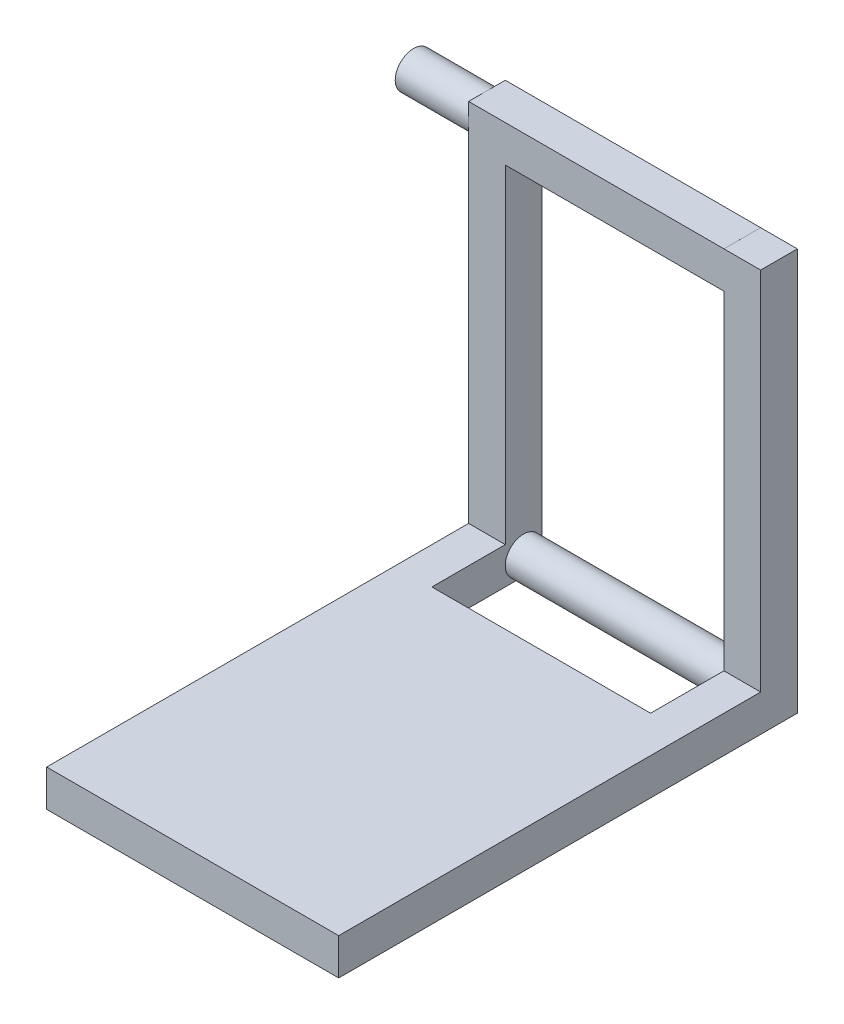
ISO-10303-21;
HEADER;
FILE_DESCRIPTION(('STEP AP214'),'2;1');
FILE_NAME('part.step','',(''),(''),'','','');
FILE_SCHEMA(('AUTOMOTIVE_DESIGN { 1 0 10303 214 1 1 1 1 }'));
ENDSEC;
DATA;
#1=APPLICATION_CONTEXT('core data for automotive mechanical design processes');
#2=APPLICATION_PROTOCOL_DEFINITION('international standard','automotive_design',2000,#1);
#3=PRODUCT_CONTEXT('',#1,'mechanical');
#4=PRODUCT('Part','Part','',(#3));
#5=PRODUCT_RELATED_PRODUCT_CATEGORY('part','',(#4));
#6=PRODUCT_DEFINITION_FORMATION('','',#4);
#7=PRODUCT_DEFINITION_CONTEXT('part definition',#1,'design');
#8=PRODUCT_DEFINITION('design','',#6,#7);
#9=PRODUCT_DEFINITION_SHAPE('','',#8);
#10=(LENGTH_UNIT() NAMED_UNIT(*) SI_UNIT(.MILLI.,.METRE.));
#11=(NAMED_UNIT(*) PLANE_ANGLE_UNIT() SI_UNIT($,.RADIAN.));
#12=(NAMED_UNIT(*) SI_UNIT($,.STERADIAN.) SOLID_ANGLE_UNIT());
#13=UNCERTAINTY_MEASURE_WITH_UNIT(LENGTH_MEASURE(1.E-05),#10,'distance_accuracy_value','');
#14=(GEOMETRIC_REPRESENTATION_CONTEXT(3) GLOBAL_UNCERTAINTY_ASSIGNED_CONTEXT((#13)) GLOBAL_UNIT_ASSIGNED_CONTEXT((#10,
#11,#12)) REPRESENTATION_CONTEXT('',''));
#15=CARTESIAN_POINT('',(0.,0.,0.));
#16=DIRECTION('',(0.,0.,1.));
#17=DIRECTION('',(1.,0.,0.));
#18=AXIS2_PLACEMENT_3D('',#15,#16,#17);
#19=CARTESIAN_POINT('',(-0.488477097251257,21.92,1.0250666456622));
#20=DIRECTION('',(0.,0.,-1.));
#21=DIRECTION('',(-1.,0.,0.));
#22=AXIS2_PLACEMENT_3D('',#19,#20,#21);
#23=PLANE('',#22);
#24=DIRECTION('',(-1.,0.,0.));
#25=VECTOR('',#24,1.);
#26=CARTESIAN_POINT('',(-0.488477097251257,1.99955859309347,1.0250666456622));
#27=LINE('',#26,#25);
#28=CARTESIAN_POINT('',(1.51152290274874,1.99955859309347,1.0250666456622));
#29=VERTEX_POINT('',#28);
#30=CARTESIAN_POINT('',(-0.488477097251257,1.99955859309347,1.0250666456622));
#31=VERTEX_POINT('',#30);
#32=EDGE_CURVE('E224',#29,#31,#27,.T.);
#33=ORIENTED_EDGE('',*,*,#32,.F.);
#34=DIRECTION('',(0.,-1.,0.));
#35=VECTOR('',#34,1.);
#36=CARTESIAN_POINT('',(1.51152290274874,21.92,1.0250666456622));
#37=LINE('',#36,#35);
#38=CARTESIAN_POINT('',(1.51152290274874,19.92,1.0250666456622));
#39=VERTEX_POINT('',#38);
#40=EDGE_CURVE('E349',#39,#29,#37,.T.);
#41=ORIENTED_EDGE('',*,*,#40,.F.);
#42=DIRECTION('',(-1.,0.,0.));
#43=VECTOR('',#42,1.);
#44=CARTESIAN_POINT('',(13.4315229027487,19.92,1.02506664566219));
#45=LINE('',#44,#43);
#46=CARTESIAN_POINT('',(13.4315229027487,19.92,1.02506664566219));
#47=VERTEX_POINT('',#46);
#48=EDGE_CURVE('E289',#47,#39,#45,.T.);
#49=ORIENTED_EDGE('',*,*,#48,.F.);
#50=DIRECTION('',(0.,-1.,0.));
#51=VECTOR('',#50,1.);
#52=CARTESIAN_POINT('',(13.4315229027487,1.99955859309347,1.02506664566219));
#53=LINE('',#52,#51);
#54=CARTESIAN_POINT('',(13.4315229027487,1.99955859309347,1.0250666456622));
#55=VERTEX_POINT('',#54);
#56=EDGE_CURVE('E292',#47,#55,#53,.T.);
#57=ORIENTED_EDGE('',*,*,#56,.T.);
#58=DIRECTION('',(-1.,0.,0.));
#59=VECTOR('',#58,1.);
#60=CARTESIAN_POINT('',(15.4315229027487,1.99955859309347,1.0250666456622));
#61=LINE('',#60,#59);
#62=CARTESIAN_POINT('',(15.4315229027487,1.99955859309347,1.0250666456622));
#63=VERTEX_POINT('',#62);
#64=EDGE_CURVE('E240',#63,#55,#61,.T.);
#65=ORIENTED_EDGE('',*,*,#64,.F.);
#66=DIRECTION('',(0.,-1.,0.));
#67=VECTOR('',#66,1.);
#68=CARTESIAN_POINT('',(15.4315229027487,1.99955859309347,1.02506664566219));
#69=LINE('',#68,#67);
#70=CARTESIAN_POINT('',(15.4315229027487,21.9195585930935,1.02506664566219));
#71=VERTEX_POINT('',#70);
#72=EDGE_CURVE('E293',#71,#63,#69,.T.);
#73=ORIENTED_EDGE('',*,*,#72,.F.);
#74=DIRECTION('',(1.,0.,0.));
#75=VECTOR('',#74,1.);
#76=CARTESIAN_POINT('',(15.4315229027487,21.9195585930935,1.02506664566219));
#77=LINE('',#76,#75);
#78=CARTESIAN_POINT('',(13.4315229027487,21.9195585930935,1.02506664566219));
#79=VERTEX_POINT('',#78);
#80=EDGE_CURVE('E264',#79,#71,#77,.T.);
#81=ORIENTED_EDGE('',*,*,#80,.F.);
#82=DIRECTION('',(0.,-1.,0.));
#83=VECTOR('',#82,1.);
#84=CARTESIAN_POINT('',(13.4315229027487,21.92,1.02506664566219));
#85=LINE('',#84,#83);
#86=CARTESIAN_POINT('',(13.4315229027487,21.92,1.02506664566219));
#87=VERTEX_POINT('',#86);
#88=EDGE_CURVE('E269',#87,#79,#85,.T.);
#89=ORIENTED_EDGE('',*,*,#88,.F.);
#90=DIRECTION('',(1.,0.,0.));
#91=VECTOR('',#90,1.);
#92=CARTESIAN_POINT('',(-0.488477097251257,21.92,1.0250666456622));
#93=LINE('',#92,#91);
#94=CARTESIAN_POINT('',(-0.488477097251257,21.92,1.0250666456622));
#95=VERTEX_POINT('',#94);
#96=EDGE_CURVE('E483',#95,#87,#93,.T.);
#97=ORIENTED_EDGE('',*,*,#96,.F.);
#98=DIRECTION('',(0.,-1.,0.));
#99=VECTOR('',#98,1.);
#100=CARTESIAN_POINT('',(-0.488477097251257,21.92,1.0250666456622));
#101=LINE('',#100,#99);
#102=CARTESIAN_POINT('',(-0.488477097251257,20.92,1.0250666456622));
#103=VERTEX_POINT('',#102);
#104=EDGE_CURVE('E340',#95,#103,#101,.T.);
#105=ORIENTED_EDGE('',*,*,#104,.T.);
#106=EDGE_CURVE('E343',#103,#31,#101,.T.);
#107=ORIENTED_EDGE('',*,*,#106,.T.);
#108=EDGE_LOOP('',(#33,#41,#49,#57,#65,#73,#81,#89,#97,#105,#107));
#109=FACE_BOUND('',#108,.T.);
#110=ADVANCED_FACE('F45',(#109),#23,.F.);
#111=CARTESIAN_POINT('',(-0.488477097251257,21.92,-0.974933354337805));
#112=DIRECTION('',(1.,0.,0.));
#113=DIRECTION('',(0.,0.,-1.));
#114=AXIS2_PLACEMENT_3D('',#111,#112,#113);
#115=PLANE('',#114);
#116=CARTESIAN_POINT('',(-0.488477097251257,20.92,0.0250666456621952));
#117=DIRECTION('',(-1.,0.,0.));
#118=DIRECTION('',(0.,0.,1.));
#119=AXIS2_PLACEMENT_3D('',#116,#117,#118);
#120=CIRCLE('',#119,1.);
#121=CARTESIAN_POINT('',(-0.488477097251257,21.92,0.0250666456621952));
#122=VERTEX_POINT('',#121);
#123=EDGE_CURVE('E321',#103,#122,#120,.T.);
#124=ORIENTED_EDGE('',*,*,#123,.F.);
#125=ORIENTED_EDGE('',*,*,#104,.F.);
#126=DIRECTION('',(0.,0.,1.));
#127=VECTOR('',#126,1.);
#128=CARTESIAN_POINT('',(-0.488477097251257,21.92,-0.974933354337805));
#129=LINE('',#128,#127);
#130=EDGE_CURVE('E477',#122,#95,#129,.T.);
#131=ORIENTED_EDGE('',*,*,#130,.F.);
#132=EDGE_LOOP('',(#124,#125,#131));
#133=FACE_BOUND('',#132,.T.);
#134=ADVANCED_FACE('F436',(#133),#115,.F.);
#135=CARTESIAN_POINT('',(-0.488477097251257,20.92,-0.974933354337805));
#136=VERTEX_POINT('',#135);
#137=EDGE_CURVE('E325',#122,#136,#120,.T.);
#138=ORIENTED_EDGE('',*,*,#137,.F.);
#139=CARTESIAN_POINT('',(-0.488477097251257,21.92,-0.974933354337805));
#140=VERTEX_POINT('',#139);
#141=EDGE_CURVE('E480',#140,#122,#129,.T.);
#142=ORIENTED_EDGE('',*,*,#141,.F.);
#143=DIRECTION('',(0.,-1.,0.));
#144=VECTOR('',#143,1.);
#145=CARTESIAN_POINT('',(-0.488477097251257,21.92,-0.974933354337805));
#146=LINE('',#145,#144);
#147=EDGE_CURVE('E490',#140,#136,#146,.T.);
#148=ORIENTED_EDGE('',*,*,#147,.T.);
#149=EDGE_LOOP('',(#138,#142,#148));
#150=FACE_BOUND('',#149,.T.);
#151=ADVANCED_FACE('F432',(#150),#115,.F.);
#152=CARTESIAN_POINT('',(1.51152290274874,21.92,-0.974933354337805));
#153=DIRECTION('',(-1.,0.,0.));
#154=DIRECTION('',(0.,0.,1.));
#155=AXIS2_PLACEMENT_3D('',#152,#153,#154);
#156=PLANE('',#155);
#157=CARTESIAN_POINT('',(1.51152290274874,0.999558593093465,0.0297089039348952));
#158=DIRECTION('',(1.,0.,0.));
#159=DIRECTION('',(0.,0.,-1.));
#160=AXIS2_PLACEMENT_3D('',#157,#158,#159);
#161=CIRCLE('',#160,1.);
#162=CARTESIAN_POINT('',(1.51152290274874,0.903314289451483,1.0250666456622));
#163=VERTEX_POINT('',#162);
#164=CARTESIAN_POINT('',(1.51152290274874,0.,0.0594178078697917));
#165=VERTEX_POINT('',#164);
#166=EDGE_CURVE('E333',#163,#165,#161,.T.);
#167=ORIENTED_EDGE('',*,*,#166,.F.);
#168=CARTESIAN_POINT('',(1.51152290274874,0.90331428945151,1.0250666456622));
#169=DIRECTION('',(0.,1.,0.));
#170=VECTOR('',#169,1.);
#171=LINE('',#168,#170);
#172=CARTESIAN_POINT('',(1.51152290274874,1.09580289673542,1.0250666456622));
#173=VERTEX_POINT('',#172);
#174=EDGE_CURVE('E354',#163,#173,#171,.T.);
#175=ORIENTED_EDGE('',*,*,#174,.T.);
#176=CARTESIAN_POINT('',(1.51152290274874,0.,0.));
#177=VERTEX_POINT('',#176);
#178=EDGE_CURVE('E336',#177,#173,#161,.T.);
#179=ORIENTED_EDGE('',*,*,#178,.F.);
#180=DIRECTION('',(0.,0.,-1.));
#181=VECTOR('',#180,1.);
#182=CARTESIAN_POINT('',(1.51152290274874,0.,-0.974933354337805));
#183=LINE('',#182,#181);
#184=CARTESIAN_POINT('',(1.51152290274874,0.,-0.974933354337805));
#185=VERTEX_POINT('',#184);
#186=EDGE_CURVE('E194',#177,#185,#183,.T.);
#187=ORIENTED_EDGE('',*,*,#186,.T.);
#188=DIRECTION('',(0.,-1.,0.));
#189=VECTOR('',#188,1.);
#190=CARTESIAN_POINT('',(1.51152290274874,21.92,-0.974933354337805));
#191=LINE('',#190,#189);
#192=CARTESIAN_POINT('',(1.51152290274874,19.92,-0.974933354337805));
#193=VERTEX_POINT('',#192);
#194=EDGE_CURVE('E346',#193,#185,#191,.T.);
#195=ORIENTED_EDGE('',*,*,#194,.F.);
#196=DIRECTION('',(0.,0.,-1.));
#197=VECTOR('',#196,1.);
#198=CARTESIAN_POINT('',(1.51152290274874,19.92,1.0250666456622));
#199=LINE('',#198,#197);
#200=EDGE_CURVE('E268',#39,#193,#199,.T.);
#201=ORIENTED_EDGE('',*,*,#200,.F.);
#202=ORIENTED_EDGE('',*,*,#40,.T.);
#203=DIRECTION('',(0.,0.,-1.));
#204=VECTOR('',#203,1.);
#205=CARTESIAN_POINT('',(1.51152290274874,1.99955859309347,5.0250666456622));
#206=LINE('',#205,#204);
#207=CARTESIAN_POINT('',(1.51152290274874,1.99955859309347,5.0250666456622));
#208=VERTEX_POINT('',#207);
#209=EDGE_CURVE('E237',#208,#29,#206,.T.);
#210=ORIENTED_EDGE('',*,*,#209,.F.);
#211=DIRECTION('',(0.,1.,0.));
#212=VECTOR('',#211,1.);
#213=CARTESIAN_POINT('',(1.51152290274874,0.,5.0250666456622));
#214=LINE('',#213,#212);
#215=CARTESIAN_POINT('',(1.51152290274874,0.,5.0250666456622));
#216=VERTEX_POINT('',#215);
#217=EDGE_CURVE('E228',#216,#208,#214,.T.);
#218=ORIENTED_EDGE('',*,*,#217,.F.);
#219=EDGE_CURVE('E471',#216,#165,#183,.T.);
#220=ORIENTED_EDGE('',*,*,#219,.T.);
#221=EDGE_LOOP('',(#167,#175,#179,#187,#195,#201,#202,#210,#218,#220));
#222=FACE_BOUND('',#221,.T.);
#223=ADVANCED_FACE('F423',(#222),#156,.F.);
#224=EDGE_CURVE('E326',#136,#103,#120,.T.);
#225=ORIENTED_EDGE('',*,*,#224,.F.);
#226=CARTESIAN_POINT('',(-0.488477097251257,0.,-0.974933354337805));
#227=VERTEX_POINT('',#226);
#228=EDGE_CURVE('E189',#136,#227,#146,.T.);
#229=ORIENTED_EDGE('',*,*,#228,.T.);
#230=DIRECTION('',(0.,0.,1.));
#231=VECTOR('',#230,1.);
#232=CARTESIAN_POINT('',(-0.488477097251257,0.,-0.974933354337805));
#233=LINE('',#232,#231);
#234=CARTESIAN_POINT('',(-0.488477097251257,0.,24.0250666456622));
#235=VERTEX_POINT('',#234);
#236=EDGE_CURVE('E183',#227,#235,#233,.T.);
#237=ORIENTED_EDGE('',*,*,#236,.T.);
#238=DIRECTION('',(0.,-1.,0.));
#239=VECTOR('',#238,1.);
#240=CARTESIAN_POINT('',(-0.488477097251257,0.,24.0250666456622));
#241=LINE('',#240,#239);
#242=CARTESIAN_POINT('',(-0.488477097251257,1.99955859309347,24.0250666456622));
#243=VERTEX_POINT('',#242);
#244=EDGE_CURVE('E187',#243,#235,#241,.T.);
#245=ORIENTED_EDGE('',*,*,#244,.F.);
#246=DIRECTION('',(0.,0.,-1.));
#247=VECTOR('',#246,1.);
#248=CARTESIAN_POINT('',(-0.488477097251257,1.99955859309347,5.0250666456622));
#249=LINE('',#248,#247);
#250=EDGE_CURVE('E232',#243,#31,#249,.T.);
#251=ORIENTED_EDGE('',*,*,#250,.T.);
#252=ORIENTED_EDGE('',*,*,#106,.F.);
#253=EDGE_LOOP('',(#225,#229,#237,#245,#251,#252));
#254=FACE_BOUND('',#253,.T.);
#255=ADVANCED_FACE('F47',(#254),#115,.F.);
#256=CARTESIAN_POINT('',(-0.488477097251257,21.92,-0.974933354337805));
#257=DIRECTION('',(0.,0.,1.));
#258=DIRECTION('',(1.,0.,0.));
#259=AXIS2_PLACEMENT_3D('',#256,#257,#258);
#260=PLANE('',#259);
#261=DIRECTION('',(-1.,0.,0.));
#262=VECTOR('',#261,1.);
#263=CARTESIAN_POINT('',(-0.488477097251257,0.,-0.974933354337805));
#264=LINE('',#263,#262);
#265=EDGE_CURVE('E474',#185,#227,#264,.T.);
#266=ORIENTED_EDGE('',*,*,#265,.T.);
#267=ORIENTED_EDGE('',*,*,#228,.F.);
#268=ORIENTED_EDGE('',*,*,#147,.F.);
#269=DIRECTION('',(-1.,0.,0.));
#270=VECTOR('',#269,1.);
#271=CARTESIAN_POINT('',(-0.488477097251257,21.92,-0.974933354337805));
#272=LINE('',#271,#270);
#273=CARTESIAN_POINT('',(13.4315229027487,21.92,-0.974933354337807));
#274=VERTEX_POINT('',#273);
#275=EDGE_CURVE('E485',#274,#140,#272,.T.);
#276=ORIENTED_EDGE('',*,*,#275,.F.);
#277=DIRECTION('',(0.,1.,0.));
#278=VECTOR('',#277,1.);
#279=CARTESIAN_POINT('',(13.4315229027487,21.92,-0.974933354337807));
#280=LINE('',#279,#278);
#281=CARTESIAN_POINT('',(13.4315229027487,21.9195585930935,-0.974933354337807));
#282=VERTEX_POINT('',#281);
#283=EDGE_CURVE('E276',#282,#274,#280,.T.);
#284=ORIENTED_EDGE('',*,*,#283,.F.);
#285=DIRECTION('',(-1.,0.,0.));
#286=VECTOR('',#285,1.);
#287=CARTESIAN_POINT('',(15.4315229027487,21.9195585930935,-0.974933354337808));
#288=LINE('',#287,#286);
#289=CARTESIAN_POINT('',(15.4315229027487,21.9195585930935,-0.974933354337808));
#290=VERTEX_POINT('',#289);
#291=EDGE_CURVE('E258',#290,#282,#288,.T.);
#292=ORIENTED_EDGE('',*,*,#291,.F.);
#293=DIRECTION('',(0.,1.,0.));
#294=VECTOR('',#293,1.);
#295=CARTESIAN_POINT('',(15.4315229027487,1.99955859309347,-0.974933354337808));
#296=LINE('',#295,#294);
#297=CARTESIAN_POINT('',(15.4315229027487,0.,-0.974933354337808));
#298=VERTEX_POINT('',#297);
#299=EDGE_CURVE('E300',#298,#290,#296,.T.);
#300=ORIENTED_EDGE('',*,*,#299,.F.);
#301=DIRECTION('',(-1.,0.,0.));
#302=VECTOR('',#301,1.);
#303=CARTESIAN_POINT('',(15.4315229027487,0.,-0.974933354337808));
#304=LINE('',#303,#302);
#305=CARTESIAN_POINT('',(13.4315229027487,0.,-0.974933354337807));
#306=VERTEX_POINT('',#305);
#307=EDGE_CURVE('E303',#298,#306,#304,.T.);
#308=ORIENTED_EDGE('',*,*,#307,.T.);
#309=DIRECTION('',(0.,1.,0.));
#310=VECTOR('',#309,1.);
#311=CARTESIAN_POINT('',(13.4315229027487,1.99955859309347,-0.974933354337807));
#312=LINE('',#311,#310);
#313=CARTESIAN_POINT('',(13.4315229027487,19.92,-0.974933354337807));
#314=VERTEX_POINT('',#313);
#315=EDGE_CURVE('E297',#306,#314,#312,.T.);
#316=ORIENTED_EDGE('',*,*,#315,.T.);
#317=DIRECTION('',(-1.,0.,0.));
#318=VECTOR('',#317,1.);
#319=CARTESIAN_POINT('',(13.4315229027487,19.92,-0.974933354337807));
#320=LINE('',#319,#318);
#321=EDGE_CURVE('E283',#314,#193,#320,.T.);
#322=ORIENTED_EDGE('',*,*,#321,.T.);
#323=ORIENTED_EDGE('',*,*,#194,.T.);
#324=EDGE_LOOP('',(#266,#267,#268,#276,#284,#292,#300,#308,#316,#322,#323));
#325=FACE_BOUND('',#324,.T.);
#326=ADVANCED_FACE('F434',(#325),#260,.F.);
#327=CARTESIAN_POINT('',(0.,21.92,0.));
#328=DIRECTION('',(0.,1.,0.));
#329=DIRECTION('',(0.,0.,1.));
#330=AXIS2_PLACEMENT_3D('',#327,#328,#329);
#331=PLANE('',#330);
#332=ORIENTED_EDGE('',*,*,#141,.T.);
#333=ORIENTED_EDGE('',*,*,#130,.T.);
#334=ORIENTED_EDGE('',*,*,#96,.T.);
#335=DIRECTION('',(0.,0.,1.));
#336=VECTOR('',#335,1.);
#337=CARTESIAN_POINT('',(13.4315229027487,21.92,1.02506664566219));
#338=LINE('',#337,#336);
#339=EDGE_CURVE('E279',#274,#87,#338,.T.);
#340=ORIENTED_EDGE('',*,*,#339,.F.);
#341=ORIENTED_EDGE('',*,*,#275,.T.);
#342=EDGE_LOOP('',(#332,#333,#334,#340,#341));
#343=FACE_BOUND('',#342,.T.);
#344=ADVANCED_FACE('F390',(#343),#331,.T.);
#345=CARTESIAN_POINT('',(0.,0.,0.));
#346=DIRECTION('',(0.,1.,0.));
#347=DIRECTION('',(0.,0.,1.));
#348=AXIS2_PLACEMENT_3D('',#345,#346,#347);
#349=PLANE('',#348);
#350=ORIENTED_EDGE('',*,*,#236,.F.);
#351=ORIENTED_EDGE('',*,*,#265,.F.);
#352=ORIENTED_EDGE('',*,*,#186,.F.);
#353=CARTESIAN_POINT('',(1.51152290274874,0.999558593093465,0.0297089039348952));
#354=DIRECTION('',(1.,0.,0.));
#355=DIRECTION('',(0.,-0.999558593093465,0.0297089039348964));
#356=AXIS2_PLACEMENT_3D('',#353,#354,#355);
#357=CIRCLE('',#356,1.);
#358=EDGE_CURVE('E467',#165,#177,#357,.T.);
#359=ORIENTED_EDGE('',*,*,#358,.F.);
#360=ORIENTED_EDGE('',*,*,#219,.F.);
#361=DIRECTION('',(1.,0.,0.));
#362=VECTOR('',#361,1.);
#363=CARTESIAN_POINT('',(-0.488477097251257,0.,5.0250666456622));
#364=LINE('',#363,#362);
#365=CARTESIAN_POINT('',(13.4315229027487,0.,5.0250666456622));
#366=VERTEX_POINT('',#365);
#367=EDGE_CURVE('E217',#216,#366,#364,.T.);
#368=ORIENTED_EDGE('',*,*,#367,.T.);
#369=DIRECTION('',(0.,0.,-1.));
#370=VECTOR('',#369,1.);
#371=CARTESIAN_POINT('',(13.4315229027487,0.,1.02506664566219));
#372=LINE('',#371,#370);
#373=CARTESIAN_POINT('',(13.4315229027487,0.,0.0594178078697891));
#374=VERTEX_POINT('',#373);
#375=EDGE_CURVE('E417',#366,#374,#372,.T.);
#376=ORIENTED_EDGE('',*,*,#375,.T.);
#377=CARTESIAN_POINT('',(13.4315229027487,0.,0.0594178078697892));
#378=DIRECTION('',(0.,0.,-1.));
#379=VECTOR('',#378,1.);
#380=LINE('',#377,#379);
#381=CARTESIAN_POINT('',(13.4315229027487,0.,0.));
#382=VERTEX_POINT('',#381);
#383=EDGE_CURVE('E57',#374,#382,#380,.T.);
#384=ORIENTED_EDGE('',*,*,#383,.T.);
#385=EDGE_CURVE('E313',#382,#306,#372,.T.);
#386=ORIENTED_EDGE('',*,*,#385,.T.);
#387=ORIENTED_EDGE('',*,*,#307,.F.);
#388=DIRECTION('',(0.,0.,-1.));
#389=VECTOR('',#388,1.);
#390=CARTESIAN_POINT('',(15.4315229027487,0.,1.02506664566219));
#391=LINE('',#390,#389);
#392=CARTESIAN_POINT('',(15.4315229027487,0.,24.0250666456622));
#393=VERTEX_POINT('',#392);
#394=EDGE_CURVE('E201',#393,#298,#391,.T.);
#395=ORIENTED_EDGE('',*,*,#394,.F.);
#396=DIRECTION('',(1.,0.,0.));
#397=VECTOR('',#396,1.);
#398=CARTESIAN_POINT('',(-0.488477097251257,0.,24.0250666456622));
#399=LINE('',#398,#397);
#400=EDGE_CURVE('E198',#235,#393,#399,.T.);
#401=ORIENTED_EDGE('',*,*,#400,.F.);
#402=EDGE_LOOP('',(#350,#351,#352,#359,#360,#368,#376,#384,#386,#387,#395,#401));
#403=FACE_BOUND('',#402,.T.);
#404=ADVANCED_FACE('F199',(#403),#349,.F.);
#405=CARTESIAN_POINT('',(13.4315229027487,0.999558593093465,0.0297089039348926));
#406=DIRECTION('',(-1.,0.,0.));
#407=DIRECTION('',(0.,0.,1.));
#408=AXIS2_PLACEMENT_3D('',#405,#406,#407);
#409=CYLINDRICAL_SURFACE('',#408,1.);
#410=CARTESIAN_POINT('',(13.4315229027487,0.999558593093465,0.0297089039348926));
#411=DIRECTION('',(1.,0.,0.));
#412=DIRECTION('',(0.,0.,-1.));
#413=AXIS2_PLACEMENT_3D('',#410,#411,#412);
#414=CIRCLE('',#413,1.);
#415=CARTESIAN_POINT('',(13.4315229027487,1.09580289673545,1.0250666456622));
#416=VERTEX_POINT('',#415);
#417=EDGE_CURVE('E195',#382,#416,#414,.T.);
#418=ORIENTED_EDGE('',*,*,#417,.F.);
#419=ORIENTED_EDGE('',*,*,#383,.F.);
#420=CARTESIAN_POINT('',(13.4315229027487,0.903314289451485,1.0250666456622));
#421=VERTEX_POINT('',#420);
#422=EDGE_CURVE('E320',#421,#374,#414,.T.);
#423=ORIENTED_EDGE('',*,*,#422,.F.);
#424=CARTESIAN_POINT('',(13.4315229027487,1.09580289673545,1.0250666456622));
#425=DIRECTION('',(0.,-1.,0.));
#426=VECTOR('',#425,1.);
#427=LINE('',#424,#426);
#428=EDGE_CURVE('E11',#416,#421,#427,.T.);
#429=ORIENTED_EDGE('',*,*,#428,.F.);
#430=EDGE_LOOP('',(#418,#419,#423,#429));
#431=FACE_BOUND('',#430,.T.);
#432=ORIENTED_EDGE('',*,*,#174,.F.);
#433=ORIENTED_EDGE('',*,*,#166,.T.);
#434=ORIENTED_EDGE('',*,*,#358,.T.);
#435=ORIENTED_EDGE('',*,*,#178,.T.);
#436=EDGE_LOOP('',(#432,#433,#434,#435));
#437=FACE_BOUND('',#436,.T.);
#438=ADVANCED_FACE('F385',(#431,#437),#409,.T.);
#439=CARTESIAN_POINT('',(-4.48847709725126,20.92,0.0250666456621957));
#440=DIRECTION('',(1.,0.,0.));
#441=DIRECTION('',(0.,0.,-1.));
#442=AXIS2_PLACEMENT_3D('',#439,#440,#441);
#443=CYLINDRICAL_SURFACE('',#442,1.);
#444=CARTESIAN_POINT('',(-4.48847709725126,20.92,0.0250666456621957));
#445=DIRECTION('',(-1.,0.,0.));
#446=DIRECTION('',(0.,0.,1.));
#447=AXIS2_PLACEMENT_3D('',#444,#445,#446);
#448=CIRCLE('',#447,1.);
#449=CARTESIAN_POINT('',(-4.48847709725126,20.92,1.0250666456622));
#450=VERTEX_POINT('',#449);
#451=EDGE_CURVE('E316',#450,#450,#448,.T.);
#452=ORIENTED_EDGE('',*,*,#451,.F.);
#453=EDGE_LOOP('',(#452));
#454=FACE_BOUND('',#453,.T.);
#455=ORIENTED_EDGE('',*,*,#123,.T.);
#456=ORIENTED_EDGE('',*,*,#137,.T.);
#457=ORIENTED_EDGE('',*,*,#224,.T.);
#458=EDGE_LOOP('',(#455,#456,#457));
#459=FACE_BOUND('',#458,.T.);
#460=ADVANCED_FACE('F382',(#454,#459),#443,.T.);
#461=CARTESIAN_POINT('',(-4.48847709725126,20.92,0.0250666456621957));
#462=DIRECTION('',(-1.,0.,0.));
#463=DIRECTION('',(0.,0.,1.));
#464=AXIS2_PLACEMENT_3D('',#461,#462,#463);
#465=PLANE('',#464);
#466=ORIENTED_EDGE('',*,*,#451,.T.);
#467=EDGE_LOOP('',(#466));
#468=FACE_BOUND('',#467,.T.);
#469=ADVANCED_FACE('F378',(#468),#465,.T.);
#470=CARTESIAN_POINT('',(13.4315229027487,0.,0.));
#471=DIRECTION('',(1.,0.,0.));
#472=DIRECTION('',(0.,0.,-1.));
#473=AXIS2_PLACEMENT_3D('',#470,#471,#472);
#474=PLANE('',#473);
#475=ORIENTED_EDGE('',*,*,#375,.F.);
#476=DIRECTION('',(0.,-1.,0.));
#477=VECTOR('',#476,1.);
#478=CARTESIAN_POINT('',(13.4315229027487,0.,5.0250666456622));
#479=LINE('',#478,#477);
#480=CARTESIAN_POINT('',(13.4315229027487,1.99955859309347,5.0250666456622));
#481=VERTEX_POINT('',#480);
#482=EDGE_CURVE('E241',#481,#366,#479,.T.);
#483=ORIENTED_EDGE('',*,*,#482,.F.);
#484=DIRECTION('',(0.,0.,-1.));
#485=VECTOR('',#484,1.);
#486=CARTESIAN_POINT('',(13.4315229027487,1.99955859309347,5.0250666456622));
#487=LINE('',#486,#485);
#488=EDGE_CURVE('E245',#481,#55,#487,.T.);
#489=ORIENTED_EDGE('',*,*,#488,.T.);
#490=ORIENTED_EDGE('',*,*,#56,.F.);
#491=DIRECTION('',(0.,0.,-1.));
#492=VECTOR('',#491,1.);
#493=CARTESIAN_POINT('',(13.4315229027487,19.92,1.02506664566219));
#494=LINE('',#493,#492);
#495=EDGE_CURVE('E272',#47,#314,#494,.T.);
#496=ORIENTED_EDGE('',*,*,#495,.T.);
#497=ORIENTED_EDGE('',*,*,#315,.F.);
#498=ORIENTED_EDGE('',*,*,#385,.F.);
#499=ORIENTED_EDGE('',*,*,#417,.T.);
#500=ORIENTED_EDGE('',*,*,#428,.T.);
#501=ORIENTED_EDGE('',*,*,#422,.T.);
#502=EDGE_LOOP('',(#475,#483,#489,#490,#496,#497,#498,#499,#500,#501));
#503=FACE_BOUND('',#502,.T.);
#504=ADVANCED_FACE('F367',(#503),#474,.F.);
#505=CARTESIAN_POINT('',(15.4315229027487,0.,0.));
#506=DIRECTION('',(1.,0.,0.));
#507=DIRECTION('',(0.,0.,-1.));
#508=AXIS2_PLACEMENT_3D('',#505,#506,#507);
#509=PLANE('',#508);
#510=ORIENTED_EDGE('',*,*,#72,.T.);
#511=DIRECTION('',(0.,0.,-1.));
#512=VECTOR('',#511,1.);
#513=CARTESIAN_POINT('',(15.4315229027487,1.99955859309347,5.0250666456622));
#514=LINE('',#513,#512);
#515=CARTESIAN_POINT('',(15.4315229027487,1.99955859309347,24.0250666456622));
#516=VERTEX_POINT('',#515);
#517=EDGE_CURVE('E251',#516,#63,#514,.T.);
#518=ORIENTED_EDGE('',*,*,#517,.F.);
#519=DIRECTION('',(0.,1.,0.));
#520=VECTOR('',#519,1.);
#521=CARTESIAN_POINT('',(15.4315229027487,0.,24.0250666456622));
#522=LINE('',#521,#520);
#523=EDGE_CURVE('E206',#393,#516,#522,.T.);
#524=ORIENTED_EDGE('',*,*,#523,.F.);
#525=ORIENTED_EDGE('',*,*,#394,.T.);
#526=ORIENTED_EDGE('',*,*,#299,.T.);
#527=DIRECTION('',(0.,0.,-1.));
#528=VECTOR('',#527,1.);
#529=CARTESIAN_POINT('',(15.4315229027487,21.9195585930935,-0.974933354337808));
#530=LINE('',#529,#528);
#531=EDGE_CURVE('E254',#71,#290,#530,.T.);
#532=ORIENTED_EDGE('',*,*,#531,.F.);
#533=EDGE_LOOP('',(#510,#518,#524,#525,#526,#532));
#534=FACE_BOUND('',#533,.T.);
#535=ADVANCED_FACE('F377',(#534),#509,.T.);
#536=CARTESIAN_POINT('',(13.4315229027487,19.92,1.02506664566219));
#537=DIRECTION('',(0.,1.,0.));
#538=DIRECTION('',(0.,0.,1.));
#539=AXIS2_PLACEMENT_3D('',#536,#537,#538);
#540=PLANE('',#539);
#541=ORIENTED_EDGE('',*,*,#200,.T.);
#542=ORIENTED_EDGE('',*,*,#321,.F.);
#543=ORIENTED_EDGE('',*,*,#495,.F.);
#544=ORIENTED_EDGE('',*,*,#48,.T.);
#545=EDGE_LOOP('',(#541,#542,#543,#544));
#546=FACE_BOUND('',#545,.T.);
#547=ADVANCED_FACE('F455',(#546),#540,.F.);
#548=CARTESIAN_POINT('',(13.4315229027487,0.,0.));
#549=DIRECTION('',(1.,0.,0.));
#550=DIRECTION('',(0.,0.,-1.));
#551=AXIS2_PLACEMENT_3D('',#548,#549,#550);
#552=PLANE('',#551);
#553=DIRECTION('',(0.,0.,1.));
#554=VECTOR('',#553,1.);
#555=CARTESIAN_POINT('',(13.4315229027487,21.9195585930935,-0.974933354337808));
#556=LINE('',#555,#554);
#557=EDGE_CURVE('E64',#282,#79,#556,.T.);
#558=ORIENTED_EDGE('',*,*,#557,.F.);
#559=ORIENTED_EDGE('',*,*,#283,.T.);
#560=ORIENTED_EDGE('',*,*,#339,.T.);
#561=ORIENTED_EDGE('',*,*,#88,.T.);
#562=EDGE_LOOP('',(#558,#559,#560,#561));
#563=FACE_BOUND('',#562,.T.);
#564=ADVANCED_FACE('F526',(#563),#552,.T.);
#565=CARTESIAN_POINT('',(0.,21.9195585930935,0.));
#566=DIRECTION('',(0.,-1.,0.));
#567=DIRECTION('',(0.,0.,-1.));
#568=AXIS2_PLACEMENT_3D('',#565,#566,#567);
#569=PLANE('',#568);
#570=ORIENTED_EDGE('',*,*,#531,.T.);
#571=ORIENTED_EDGE('',*,*,#291,.T.);
#572=ORIENTED_EDGE('',*,*,#557,.T.);
#573=ORIENTED_EDGE('',*,*,#80,.T.);
#574=EDGE_LOOP('',(#570,#571,#572,#573));
#575=FACE_BOUND('',#574,.T.);
#576=ADVANCED_FACE('F524',(#575),#569,.F.);
#577=CARTESIAN_POINT('',(15.4315229027487,1.99955859309347,5.0250666456622));
#578=DIRECTION('',(0.,-1.,0.));
#579=DIRECTION('',(0.,0.,-1.));
#580=AXIS2_PLACEMENT_3D('',#577,#578,#579);
#581=PLANE('',#580);
#582=ORIENTED_EDGE('',*,*,#64,.T.);
#583=ORIENTED_EDGE('',*,*,#488,.F.);
#584=DIRECTION('',(-1.,0.,0.));
#585=VECTOR('',#584,1.);
#586=CARTESIAN_POINT('',(-0.488477097251257,1.99955859309347,5.0250666456622));
#587=LINE('',#586,#585);
#588=EDGE_CURVE('E213',#481,#208,#587,.T.);
#589=ORIENTED_EDGE('',*,*,#588,.T.);
#590=ORIENTED_EDGE('',*,*,#209,.T.);
#591=ORIENTED_EDGE('',*,*,#32,.T.);
#592=ORIENTED_EDGE('',*,*,#250,.F.);
#593=DIRECTION('',(-1.,0.,0.));
#594=VECTOR('',#593,1.);
#595=CARTESIAN_POINT('',(-0.488477097251257,1.99955859309347,24.0250666456622));
#596=LINE('',#595,#594);
#597=EDGE_CURVE('E211',#516,#243,#596,.T.);
#598=ORIENTED_EDGE('',*,*,#597,.F.);
#599=ORIENTED_EDGE('',*,*,#517,.T.);
#600=EDGE_LOOP('',(#582,#583,#589,#590,#591,#592,#598,#599));
#601=FACE_BOUND('',#600,.T.);
#602=ADVANCED_FACE('F532',(#601),#581,.F.);
#603=CARTESIAN_POINT('',(0.,0.,24.0250666456622));
#604=DIRECTION('',(0.,0.,-1.));
#605=DIRECTION('',(-1.,0.,0.));
#606=AXIS2_PLACEMENT_3D('',#603,#604,#605);
#607=PLANE('',#606);
#608=ORIENTED_EDGE('',*,*,#244,.T.);
#609=ORIENTED_EDGE('',*,*,#400,.T.);
#610=ORIENTED_EDGE('',*,*,#523,.T.);
#611=ORIENTED_EDGE('',*,*,#597,.T.);
#612=EDGE_LOOP('',(#608,#609,#610,#611));
#613=FACE_BOUND('',#612,.T.);
#614=ADVANCED_FACE('F209',(#613),#607,.F.);
#615=CARTESIAN_POINT('',(0.,0.,5.0250666456622));
#616=DIRECTION('',(0.,0.,-1.));
#617=DIRECTION('',(-1.,0.,0.));
#618=AXIS2_PLACEMENT_3D('',#615,#616,#617);
#619=PLANE('',#618);
#620=ORIENTED_EDGE('',*,*,#588,.F.);
#621=ORIENTED_EDGE('',*,*,#482,.T.);
#622=ORIENTED_EDGE('',*,*,#367,.F.);
#623=ORIENTED_EDGE('',*,*,#217,.T.);
#624=EDGE_LOOP('',(#620,#621,#622,#623));
#625=FACE_BOUND('',#624,.T.);
#626=ADVANCED_FACE('F516',(#625),#619,.T.);
#627=CLOSED_SHELL('',(#110,#134,#151,#223,#255,#326,#344,#404,#438,#460,#469,#504,#535,#547,
#564,#576,#602,#614,#626));
#628=MANIFOLD_SOLID_BREP('B2',#627);
#629=ADVANCED_BREP_SHAPE_REPRESENTATION('',(#18,#628),#14);
#630=SHAPE_DEFINITION_REPRESENTATION(#9,#629);
ENDSEC;
END-ISO-10303-21;
